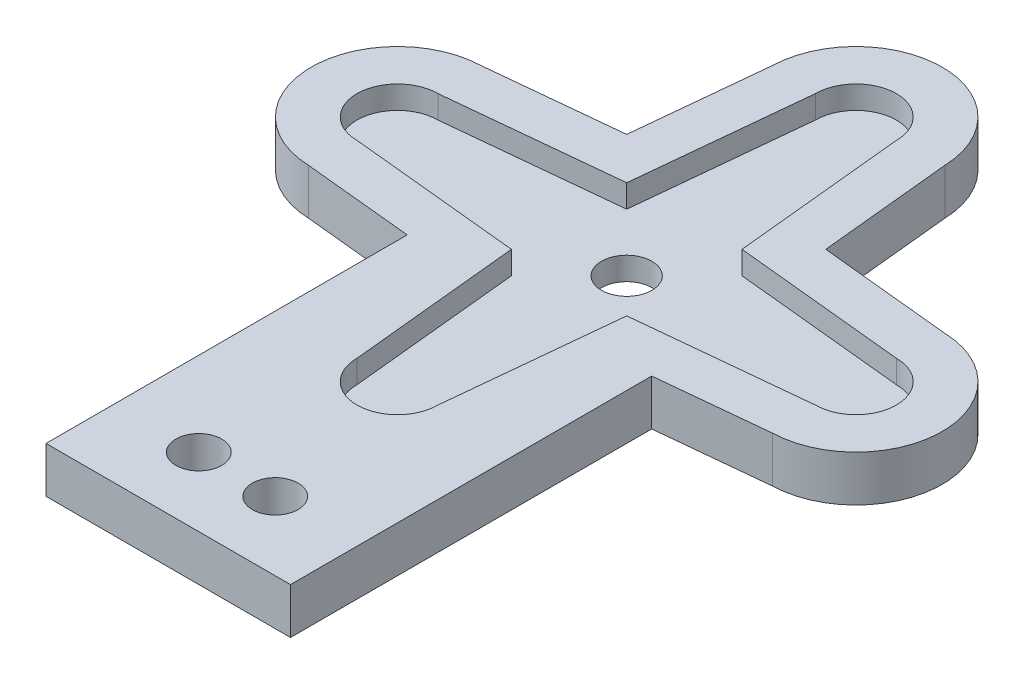
ISO-10303-21;
HEADER;
FILE_DESCRIPTION(('STEP AP214'),'2;1');
FILE_NAME('part.step','',(''),(''),'','','');
FILE_SCHEMA(('AUTOMOTIVE_DESIGN { 1 0 10303 214 1 1 1 1 }'));
ENDSEC;
DATA;
#1=APPLICATION_CONTEXT('core data for automotive mechanical design processes');
#2=APPLICATION_PROTOCOL_DEFINITION('international standard','automotive_design',2000,#1);
#3=PRODUCT_CONTEXT('',#1,'mechanical');
#4=PRODUCT('Part','Part','',(#3));
#5=PRODUCT_RELATED_PRODUCT_CATEGORY('part','',(#4));
#6=PRODUCT_DEFINITION_FORMATION('','',#4);
#7=PRODUCT_DEFINITION_CONTEXT('part definition',#1,'design');
#8=PRODUCT_DEFINITION('design','',#6,#7);
#9=PRODUCT_DEFINITION_SHAPE('','',#8);
#10=(LENGTH_UNIT() NAMED_UNIT(*) SI_UNIT(.MILLI.,.METRE.));
#11=(NAMED_UNIT(*) PLANE_ANGLE_UNIT() SI_UNIT($,.RADIAN.));
#12=(NAMED_UNIT(*) SI_UNIT($,.STERADIAN.) SOLID_ANGLE_UNIT());
#13=UNCERTAINTY_MEASURE_WITH_UNIT(LENGTH_MEASURE(1.E-05),#10,'distance_accuracy_value','');
#14=(GEOMETRIC_REPRESENTATION_CONTEXT(3) GLOBAL_UNCERTAINTY_ASSIGNED_CONTEXT((#13)) GLOBAL_UNIT_ASSIGNED_CONTEXT((#10,
#11,#12)) REPRESENTATION_CONTEXT('',''));
#15=CARTESIAN_POINT('',(0.,0.,0.));
#16=DIRECTION('',(0.,0.,1.));
#17=DIRECTION('',(1.,0.,0.));
#18=AXIS2_PLACEMENT_3D('',#15,#16,#17);
#19=CARTESIAN_POINT('',(0.,1.5,0.));
#20=DIRECTION('',(0.,1.,0.));
#21=DIRECTION('',(0.,0.,1.));
#22=AXIS2_PLACEMENT_3D('',#19,#20,#21);
#23=PLANE('',#22);
#24=DIRECTION('',(0.99503719020999,0.,0.0995037190209885));
#25=VECTOR('',#24,1.);
#26=CARTESIAN_POINT('',(-0.709402246171833,1.5,7.09402246171908));
#27=LINE('',#26,#25);
#28=CARTESIAN_POINT('',(-15.1775224357825,1.5,5.64721044275817));
#29=VERTEX_POINT('',#28);
#30=CARTESIAN_POINT('',(-8.00000000000001,1.5,6.36496268633634));
#31=VERTEX_POINT('',#30);
#32=EDGE_CURVE('E299',#29,#31,#27,.T.);
#33=ORIENTED_EDGE('',*,*,#32,.T.);
#34=DIRECTION('',(0.,0.,1.));
#35=VECTOR('',#34,1.);
#36=CARTESIAN_POINT('',(-7.99999999999999,1.5,0.));
#37=LINE('',#36,#35);
#38=CARTESIAN_POINT('',(-8.,1.5,30.));
#39=VERTEX_POINT('',#38);
#40=EDGE_CURVE('E97',#31,#39,#37,.T.);
#41=ORIENTED_EDGE('',*,*,#40,.T.);
#42=DIRECTION('',(1.,0.,0.));
#43=VECTOR('',#42,1.);
#44=CARTESIAN_POINT('',(-8.,1.5,30.));
#45=LINE('',#44,#43);
#46=CARTESIAN_POINT('',(8.,1.5,30.));
#47=VERTEX_POINT('',#46);
#48=EDGE_CURVE('E63',#39,#47,#45,.T.);
#49=ORIENTED_EDGE('',*,*,#48,.T.);
#50=DIRECTION('',(0.,0.,-1.));
#51=VECTOR('',#50,1.);
#52=CARTESIAN_POINT('',(7.99999999999999,1.5,0.));
#53=LINE('',#52,#51);
#54=CARTESIAN_POINT('',(8.,1.5,6.36496268633621));
#55=VERTEX_POINT('',#54);
#56=EDGE_CURVE('E92',#47,#55,#53,.T.);
#57=ORIENTED_EDGE('',*,*,#56,.T.);
#58=DIRECTION('',(0.995037190209989,0.,-0.0995037190209984));
#59=VECTOR('',#58,1.);
#60=CARTESIAN_POINT('',(0.709402246171898,1.5,7.09402246171902));
#61=LINE('',#60,#59);
#62=CARTESIAN_POINT('',(15.1775224357825,1.5,5.64721044275796));
#63=VERTEX_POINT('',#62);
#64=EDGE_CURVE('E302',#55,#63,#61,.T.);
#65=ORIENTED_EDGE('',*,*,#64,.T.);
#66=CARTESIAN_POINT('',(15.,1.5,0.));
#67=DIRECTION('',(0.,1.,0.));
#68=DIRECTION('',(0.,0.,1.));
#69=AXIS2_PLACEMENT_3D('',#66,#67,#68);
#70=CIRCLE('',#69,5.65000000000012);
#71=CARTESIAN_POINT('',(15.1775224357825,1.5,-5.64721044275807));
#72=VERTEX_POINT('',#71);
#73=EDGE_CURVE('E305',#63,#72,#70,.T.);
#74=ORIENTED_EDGE('',*,*,#73,.T.);
#75=DIRECTION('',(-0.995037190209989,0.,-0.0995037190209997));
#76=VECTOR('',#75,1.);
#77=CARTESIAN_POINT('',(0.709402246171919,1.5,-7.09402246171914));
#78=LINE('',#77,#76);
#79=CARTESIAN_POINT('',(6.51360244212387,1.5,-6.51360244212394));
#80=VERTEX_POINT('',#79);
#81=EDGE_CURVE('E281',#72,#80,#78,.T.);
#82=ORIENTED_EDGE('',*,*,#81,.T.);
#83=DIRECTION('',(-0.0995037190209991,0.,-0.995037190209989));
#84=VECTOR('',#83,1.);
#85=CARTESIAN_POINT('',(7.09402246171908,1.5,-0.709402246171909));
#86=LINE('',#85,#84);
#87=CARTESIAN_POINT('',(5.64721044275801,1.5,-15.1775224357825));
#88=VERTEX_POINT('',#87);
#89=EDGE_CURVE('E284',#80,#88,#86,.T.);
#90=ORIENTED_EDGE('',*,*,#89,.T.);
#91=CARTESIAN_POINT('',(0.,1.5,-15.));
#92=DIRECTION('',(0.,1.,0.));
#93=DIRECTION('',(0.,0.,1.));
#94=AXIS2_PLACEMENT_3D('',#91,#92,#93);
#95=CIRCLE('',#94,5.65000000000012);
#96=CARTESIAN_POINT('',(-5.64721044275801,1.5,-15.1775224357825));
#97=VERTEX_POINT('',#96);
#98=EDGE_CURVE('E287',#88,#97,#95,.T.);
#99=ORIENTED_EDGE('',*,*,#98,.T.);
#100=DIRECTION('',(-0.0995037190209989,0.,0.995037190209989));
#101=VECTOR('',#100,1.);
#102=CARTESIAN_POINT('',(-7.09402246171908,1.5,-0.709402246171907));
#103=LINE('',#102,#101);
#104=CARTESIAN_POINT('',(-6.51360244212388,1.5,-6.51360244212382));
#105=VERTEX_POINT('',#104);
#106=EDGE_CURVE('E290',#97,#105,#103,.T.);
#107=ORIENTED_EDGE('',*,*,#106,.T.);
#108=DIRECTION('',(-0.995037190209988,0.,0.0995037190210094));
#109=VECTOR('',#108,1.);
#110=CARTESIAN_POINT('',(-0.709402246171983,1.5,-7.09402246171907));
#111=LINE('',#110,#109);
#112=CARTESIAN_POINT('',(-15.1775224357826,1.5,-5.64721044275786));
#113=VERTEX_POINT('',#112);
#114=EDGE_CURVE('E293',#105,#113,#111,.T.);
#115=ORIENTED_EDGE('',*,*,#114,.T.);
#116=CARTESIAN_POINT('',(-15.,1.5,1.57116660247941E-13));
#117=DIRECTION('',(0.,1.,0.));
#118=DIRECTION('',(0.,0.,1.));
#119=AXIS2_PLACEMENT_3D('',#116,#117,#118);
#120=CIRCLE('',#119,5.65000000000012);
#121=EDGE_CURVE('E296',#113,#29,#120,.T.);
#122=ORIENTED_EDGE('',*,*,#121,.T.);
#123=EDGE_LOOP('',(#33,#41,#49,#57,#65,#74,#82,#90,#99,#107,#115,#122));
#124=FACE_BOUND('',#123,.T.);
#125=CARTESIAN_POINT('',(2.5,1.5,25.5));
#126=DIRECTION('',(0.,1.,0.));
#127=DIRECTION('',(0.,0.,1.));
#128=AXIS2_PLACEMENT_3D('',#125,#126,#127);
#129=CIRCLE('',#128,1.5);
#130=CARTESIAN_POINT('',(2.5,1.5,27.));
#131=VERTEX_POINT('',#130);
#132=EDGE_CURVE('E219',#131,#131,#129,.T.);
#133=ORIENTED_EDGE('',*,*,#132,.F.);
#134=EDGE_LOOP('',(#133));
#135=FACE_BOUND('',#134,.T.);
#136=CARTESIAN_POINT('',(-2.49999999999999,1.5,25.5));
#137=DIRECTION('',(0.,1.,0.));
#138=DIRECTION('',(0.,0.,1.));
#139=AXIS2_PLACEMENT_3D('',#136,#137,#138);
#140=CIRCLE('',#139,1.5);
#141=CARTESIAN_POINT('',(-2.49999999999999,1.5,27.));
#142=VERTEX_POINT('',#141);
#143=EDGE_CURVE('E216',#142,#142,#140,.T.);
#144=ORIENTED_EDGE('',*,*,#143,.F.);
#145=EDGE_LOOP('',(#144));
#146=FACE_BOUND('',#145,.T.);
#147=DIRECTION('',(-0.995037190209988,0.,0.0995037190210094));
#148=VECTOR('',#147,1.);
#149=CARTESIAN_POINT('',(-0.410891089108954,1.5,-4.1089108910891));
#150=LINE('',#149,#148);
#151=CARTESIAN_POINT('',(-3.77272727272728,1.5,-3.77272727272724));
#152=VERTEX_POINT('',#151);
#153=CARTESIAN_POINT('',(-15.,1.5,-2.64999999999984));
#154=VERTEX_POINT('',#153);
#155=EDGE_CURVE('E163',#152,#154,#150,.T.);
#156=ORIENTED_EDGE('',*,*,#155,.F.);
#157=DIRECTION('',(0.0995037190209989,0.,-0.995037190209989));
#158=VECTOR('',#157,1.);
#159=CARTESIAN_POINT('',(-4.10891089108911,1.5,-0.410891089108911));
#160=LINE('',#159,#158);
#161=CARTESIAN_POINT('',(-2.65,1.5,-15.));
#162=VERTEX_POINT('',#161);
#163=EDGE_CURVE('E115',#152,#162,#160,.T.);
#164=ORIENTED_EDGE('',*,*,#163,.T.);
#165=CARTESIAN_POINT('',(0.,1.5,-15.));
#166=DIRECTION('',(0.,-1.,0.));
#167=DIRECTION('',(0.,0.,-1.));
#168=AXIS2_PLACEMENT_3D('',#165,#166,#167);
#169=CIRCLE('',#168,2.65);
#170=CARTESIAN_POINT('',(2.65,1.5,-15.));
#171=VERTEX_POINT('',#170);
#172=EDGE_CURVE('E118',#162,#171,#169,.T.);
#173=ORIENTED_EDGE('',*,*,#172,.T.);
#174=DIRECTION('',(0.0995037190209989,0.,0.995037190209989));
#175=VECTOR('',#174,1.);
#176=CARTESIAN_POINT('',(4.10891089108911,1.5,-0.410891089108911));
#177=LINE('',#176,#175);
#178=CARTESIAN_POINT('',(3.77272727272727,1.5,-3.77272727272733));
#179=VERTEX_POINT('',#178);
#180=EDGE_CURVE('E111',#171,#179,#177,.T.);
#181=ORIENTED_EDGE('',*,*,#180,.T.);
#182=DIRECTION('',(-0.99503719020999,0.,-0.0995037190209955));
#183=VECTOR('',#182,1.);
#184=CARTESIAN_POINT('',(0.410891089108896,1.5,-4.10891089108911));
#185=LINE('',#184,#183);
#186=CARTESIAN_POINT('',(15.,1.5,-2.65000000000005));
#187=VERTEX_POINT('',#186);
#188=EDGE_CURVE('E139',#187,#179,#185,.T.);
#189=ORIENTED_EDGE('',*,*,#188,.F.);
#190=CARTESIAN_POINT('',(15.,1.5,0.));
#191=DIRECTION('',(0.,1.,0.));
#192=DIRECTION('',(1.,0.,0.));
#193=AXIS2_PLACEMENT_3D('',#190,#191,#192);
#194=CIRCLE('',#193,2.65);
#195=CARTESIAN_POINT('',(15.,1.5,2.64999999999995));
#196=VERTEX_POINT('',#195);
#197=EDGE_CURVE('E142',#196,#187,#194,.T.);
#198=ORIENTED_EDGE('',*,*,#197,.F.);
#199=DIRECTION('',(0.995037190209989,0.,-0.0995037190210024));
#200=VECTOR('',#199,1.);
#201=CARTESIAN_POINT('',(0.410891089108925,1.5,4.10891089108911));
#202=LINE('',#201,#200);
#203=CARTESIAN_POINT('',(3.77272727272728,1.5,3.77272727272721));
#204=VERTEX_POINT('',#203);
#205=EDGE_CURVE('E135',#204,#196,#202,.T.);
#206=ORIENTED_EDGE('',*,*,#205,.F.);
#207=DIRECTION('',(0.0995037190209989,0.,-0.995037190209989));
#208=VECTOR('',#207,1.);
#209=CARTESIAN_POINT('',(4.10891089108911,1.5,0.410891089108911));
#210=LINE('',#209,#208);
#211=CARTESIAN_POINT('',(2.65,1.5,15.));
#212=VERTEX_POINT('',#211);
#213=EDGE_CURVE('E193',#212,#204,#210,.T.);
#214=ORIENTED_EDGE('',*,*,#213,.F.);
#215=CARTESIAN_POINT('',(0.,1.5,15.));
#216=DIRECTION('',(0.,1.,0.));
#217=DIRECTION('',(0.,0.,1.));
#218=AXIS2_PLACEMENT_3D('',#215,#216,#217);
#219=CIRCLE('',#218,2.65);
#220=CARTESIAN_POINT('',(-2.65,1.5,15.));
#221=VERTEX_POINT('',#220);
#222=EDGE_CURVE('E196',#221,#212,#219,.T.);
#223=ORIENTED_EDGE('',*,*,#222,.F.);
#224=DIRECTION('',(0.0995037190209989,0.,0.995037190209989));
#225=VECTOR('',#224,1.);
#226=CARTESIAN_POINT('',(-4.10891089108911,1.5,0.410891089108911));
#227=LINE('',#226,#225);
#228=CARTESIAN_POINT('',(-3.77272727272727,1.5,3.77272727272731));
#229=VERTEX_POINT('',#228);
#230=EDGE_CURVE('E189',#229,#221,#227,.T.);
#231=ORIENTED_EDGE('',*,*,#230,.F.);
#232=DIRECTION('',(0.99503719020999,0.,0.0995037190209885));
#233=VECTOR('',#232,1.);
#234=CARTESIAN_POINT('',(-0.410891089108868,1.5,4.10891089108911));
#235=LINE('',#234,#233);
#236=CARTESIAN_POINT('',(-15.,1.5,2.65000000000016));
#237=VERTEX_POINT('',#236);
#238=EDGE_CURVE('E167',#237,#229,#235,.T.);
#239=ORIENTED_EDGE('',*,*,#238,.F.);
#240=CARTESIAN_POINT('',(-15.,1.5,1.57116660247941E-13));
#241=DIRECTION('',(0.,1.,0.));
#242=DIRECTION('',(-1.,0.,0.));
#243=AXIS2_PLACEMENT_3D('',#240,#241,#242);
#244=CIRCLE('',#243,2.65);
#245=EDGE_CURVE('E170',#154,#237,#244,.T.);
#246=ORIENTED_EDGE('',*,*,#245,.F.);
#247=EDGE_LOOP('',(#156,#164,#173,#181,#189,#198,#206,#214,#223,#231,#239,#246));
#248=FACE_BOUND('',#247,.T.);
#249=ADVANCED_FACE('F39',(#124,#135,#146,#248),#23,.T.);
#250=CARTESIAN_POINT('',(0.,0.,0.));
#251=DIRECTION('',(0.,1.,0.));
#252=DIRECTION('',(0.,0.,1.));
#253=AXIS2_PLACEMENT_3D('',#250,#251,#252);
#254=PLANE('',#253);
#255=CARTESIAN_POINT('',(0.,0.,0.));
#256=DIRECTION('',(0.,1.,0.));
#257=DIRECTION('',(0.,0.,1.));
#258=AXIS2_PLACEMENT_3D('',#255,#256,#257);
#259=CIRCLE('',#258,1.65);
#260=CARTESIAN_POINT('',(0.,0.,1.65));
#261=VERTEX_POINT('',#260);
#262=EDGE_CURVE('E212',#261,#261,#259,.T.);
#263=ORIENTED_EDGE('',*,*,#262,.F.);
#264=EDGE_LOOP('',(#263));
#265=FACE_BOUND('',#264,.T.);
#266=DIRECTION('',(-0.99503719020999,0.,-0.0995037190209955));
#267=VECTOR('',#266,1.);
#268=CARTESIAN_POINT('',(0.410891089108896,0.,-4.10891089108911));
#269=LINE('',#268,#267);
#270=CARTESIAN_POINT('',(15.,0.,-2.65000000000005));
#271=VERTEX_POINT('',#270);
#272=CARTESIAN_POINT('',(3.77272727272727,0.,-3.77272727272733));
#273=VERTEX_POINT('',#272);
#274=EDGE_CURVE('E148',#271,#273,#269,.T.);
#275=ORIENTED_EDGE('',*,*,#274,.T.);
#276=DIRECTION('',(0.0995037190209989,0.,0.995037190209989));
#277=VECTOR('',#276,1.);
#278=CARTESIAN_POINT('',(4.10891089108911,0.,-0.410891089108911));
#279=LINE('',#278,#277);
#280=CARTESIAN_POINT('',(2.65,0.,-15.));
#281=VERTEX_POINT('',#280);
#282=EDGE_CURVE('E108',#281,#273,#279,.T.);
#283=ORIENTED_EDGE('',*,*,#282,.F.);
#284=CARTESIAN_POINT('',(0.,0.,-15.));
#285=DIRECTION('',(0.,-1.,0.));
#286=DIRECTION('',(0.,0.,-1.));
#287=AXIS2_PLACEMENT_3D('',#284,#285,#286);
#288=CIRCLE('',#287,2.65);
#289=CARTESIAN_POINT('',(-2.65,0.,-15.));
#290=VERTEX_POINT('',#289);
#291=EDGE_CURVE('E114',#290,#281,#288,.T.);
#292=ORIENTED_EDGE('',*,*,#291,.F.);
#293=DIRECTION('',(0.0995037190209989,0.,-0.995037190209989));
#294=VECTOR('',#293,1.);
#295=CARTESIAN_POINT('',(-4.10891089108911,0.,-0.410891089108911));
#296=LINE('',#295,#294);
#297=CARTESIAN_POINT('',(-3.77272727272728,0.,-3.77272727272724));
#298=VERTEX_POINT('',#297);
#299=EDGE_CURVE('E124',#298,#290,#296,.T.);
#300=ORIENTED_EDGE('',*,*,#299,.F.);
#301=DIRECTION('',(-0.995037190209988,0.,0.0995037190210094));
#302=VECTOR('',#301,1.);
#303=CARTESIAN_POINT('',(-0.410891089108954,0.,-4.1089108910891));
#304=LINE('',#303,#302);
#305=CARTESIAN_POINT('',(-15.,0.,-2.64999999999984));
#306=VERTEX_POINT('',#305);
#307=EDGE_CURVE('E54',#298,#306,#304,.T.);
#308=ORIENTED_EDGE('',*,*,#307,.T.);
#309=CARTESIAN_POINT('',(-15.,0.,1.57116660247941E-13));
#310=DIRECTION('',(0.,1.,0.));
#311=DIRECTION('',(-1.,0.,0.));
#312=AXIS2_PLACEMENT_3D('',#309,#310,#311);
#313=CIRCLE('',#312,2.65);
#314=CARTESIAN_POINT('',(-15.,0.,2.65000000000016));
#315=VERTEX_POINT('',#314);
#316=EDGE_CURVE('E166',#306,#315,#313,.T.);
#317=ORIENTED_EDGE('',*,*,#316,.T.);
#318=DIRECTION('',(0.99503719020999,0.,0.0995037190209885));
#319=VECTOR('',#318,1.);
#320=CARTESIAN_POINT('',(-0.410891089108868,0.,4.10891089108911));
#321=LINE('',#320,#319);
#322=CARTESIAN_POINT('',(-3.77272727272727,0.,3.77272727272731));
#323=VERTEX_POINT('',#322);
#324=EDGE_CURVE('E175',#315,#323,#321,.T.);
#325=ORIENTED_EDGE('',*,*,#324,.T.);
#326=DIRECTION('',(0.0995037190209989,0.,0.995037190209989));
#327=VECTOR('',#326,1.);
#328=CARTESIAN_POINT('',(-4.10891089108911,0.,0.410891089108911));
#329=LINE('',#328,#327);
#330=CARTESIAN_POINT('',(-2.65,0.,15.));
#331=VERTEX_POINT('',#330);
#332=EDGE_CURVE('E186',#323,#331,#329,.T.);
#333=ORIENTED_EDGE('',*,*,#332,.T.);
#334=CARTESIAN_POINT('',(0.,0.,15.));
#335=DIRECTION('',(0.,1.,0.));
#336=DIRECTION('',(0.,0.,1.));
#337=AXIS2_PLACEMENT_3D('',#334,#335,#336);
#338=CIRCLE('',#337,2.65);
#339=CARTESIAN_POINT('',(2.65,0.,15.));
#340=VERTEX_POINT('',#339);
#341=EDGE_CURVE('E192',#331,#340,#338,.T.);
#342=ORIENTED_EDGE('',*,*,#341,.T.);
#343=DIRECTION('',(0.0995037190209989,0.,-0.995037190209989));
#344=VECTOR('',#343,1.);
#345=CARTESIAN_POINT('',(4.10891089108911,0.,0.410891089108911));
#346=LINE('',#345,#344);
#347=CARTESIAN_POINT('',(3.77272727272728,0.,3.77272727272721));
#348=VERTEX_POINT('',#347);
#349=EDGE_CURVE('E202',#340,#348,#346,.T.);
#350=ORIENTED_EDGE('',*,*,#349,.T.);
#351=DIRECTION('',(0.995037190209989,0.,-0.0995037190210024));
#352=VECTOR('',#351,1.);
#353=CARTESIAN_POINT('',(0.410891089108925,0.,4.10891089108911));
#354=LINE('',#353,#352);
#355=CARTESIAN_POINT('',(15.,0.,2.64999999999995));
#356=VERTEX_POINT('',#355);
#357=EDGE_CURVE('E132',#348,#356,#354,.T.);
#358=ORIENTED_EDGE('',*,*,#357,.T.);
#359=CARTESIAN_POINT('',(15.,0.,0.));
#360=DIRECTION('',(0.,1.,0.));
#361=DIRECTION('',(1.,0.,0.));
#362=AXIS2_PLACEMENT_3D('',#359,#360,#361);
#363=CIRCLE('',#362,2.65);
#364=EDGE_CURVE('E138',#356,#271,#363,.T.);
#365=ORIENTED_EDGE('',*,*,#364,.T.);
#366=EDGE_LOOP('',(#275,#283,#292,#300,#308,#317,#325,#333,#342,#350,#358,#365));
#367=FACE_BOUND('',#366,.T.);
#368=ADVANCED_FACE('F425',(#265,#367),#254,.T.);
#369=CARTESIAN_POINT('',(0.,-1.5,0.));
#370=DIRECTION('',(0.,1.,0.));
#371=DIRECTION('',(0.,0.,1.));
#372=AXIS2_PLACEMENT_3D('',#369,#370,#371);
#373=PLANE('',#372);
#374=CARTESIAN_POINT('',(2.5,-1.5,25.5));
#375=DIRECTION('',(0.,1.,0.));
#376=DIRECTION('',(0.,0.,1.));
#377=AXIS2_PLACEMENT_3D('',#374,#375,#376);
#378=CIRCLE('',#377,1.5);
#379=CARTESIAN_POINT('',(2.5,-1.5,27.));
#380=VERTEX_POINT('',#379);
#381=EDGE_CURVE('E215',#380,#380,#378,.F.);
#382=ORIENTED_EDGE('',*,*,#381,.F.);
#383=EDGE_LOOP('',(#382));
#384=FACE_BOUND('',#383,.T.);
#385=CARTESIAN_POINT('',(-2.49999999999999,-1.5,25.5));
#386=DIRECTION('',(0.,1.,0.));
#387=DIRECTION('',(0.,0.,1.));
#388=AXIS2_PLACEMENT_3D('',#385,#386,#387);
#389=CIRCLE('',#388,1.5);
#390=CARTESIAN_POINT('',(-2.49999999999999,-1.5,27.));
#391=VERTEX_POINT('',#390);
#392=EDGE_CURVE('E220',#391,#391,#389,.F.);
#393=ORIENTED_EDGE('',*,*,#392,.F.);
#394=EDGE_LOOP('',(#393));
#395=FACE_BOUND('',#394,.T.);
#396=CARTESIAN_POINT('',(0.,-1.5,0.));
#397=DIRECTION('',(0.,1.,0.));
#398=DIRECTION('',(0.,0.,1.));
#399=AXIS2_PLACEMENT_3D('',#396,#397,#398);
#400=CIRCLE('',#399,1.65);
#401=CARTESIAN_POINT('',(0.,-1.5,1.65));
#402=VERTEX_POINT('',#401);
#403=EDGE_CURVE('E209',#402,#402,#400,.F.);
#404=ORIENTED_EDGE('',*,*,#403,.F.);
#405=EDGE_LOOP('',(#404));
#406=FACE_BOUND('',#405,.T.);
#407=DIRECTION('',(0.,0.,1.));
#408=VECTOR('',#407,1.);
#409=CARTESIAN_POINT('',(-7.99999999999999,-1.5,0.));
#410=LINE('',#409,#408);
#411=CARTESIAN_POINT('',(-8.00000000000001,-1.5,6.36496268633634));
#412=VERTEX_POINT('',#411);
#413=CARTESIAN_POINT('',(-8.,-1.5,30.));
#414=VERTEX_POINT('',#413);
#415=EDGE_CURVE('E84',#412,#414,#410,.T.);
#416=ORIENTED_EDGE('',*,*,#415,.F.);
#417=DIRECTION('',(0.99503719020999,0.,0.0995037190209885));
#418=VECTOR('',#417,1.);
#419=CARTESIAN_POINT('',(-0.709402246171833,-1.5,7.09402246171908));
#420=LINE('',#419,#418);
#421=CARTESIAN_POINT('',(-15.1775224357825,-1.5,5.64721044275817));
#422=VERTEX_POINT('',#421);
#423=EDGE_CURVE('E274',#422,#412,#420,.T.);
#424=ORIENTED_EDGE('',*,*,#423,.F.);
#425=CARTESIAN_POINT('',(-15.,-1.5,1.57116660247941E-13));
#426=DIRECTION('',(0.,1.,0.));
#427=DIRECTION('',(0.,0.,1.));
#428=AXIS2_PLACEMENT_3D('',#425,#426,#427);
#429=CIRCLE('',#428,5.65000000000012);
#430=CARTESIAN_POINT('',(-15.1775224357826,-1.5,-5.64721044275786));
#431=VERTEX_POINT('',#430);
#432=EDGE_CURVE('E271',#431,#422,#429,.T.);
#433=ORIENTED_EDGE('',*,*,#432,.F.);
#434=DIRECTION('',(-0.995037190209988,0.,0.0995037190210094));
#435=VECTOR('',#434,1.);
#436=CARTESIAN_POINT('',(-0.709402246171983,-1.5,-7.09402246171907));
#437=LINE('',#436,#435);
#438=CARTESIAN_POINT('',(-6.51360244212388,-1.5,-6.51360244212382));
#439=VERTEX_POINT('',#438);
#440=EDGE_CURVE('E268',#439,#431,#437,.T.);
#441=ORIENTED_EDGE('',*,*,#440,.F.);
#442=DIRECTION('',(-0.0995037190209989,0.,0.995037190209989));
#443=VECTOR('',#442,1.);
#444=CARTESIAN_POINT('',(-7.09402246171908,-1.5,-0.709402246171907));
#445=LINE('',#444,#443);
#446=CARTESIAN_POINT('',(-5.64721044275801,-1.5,-15.1775224357825));
#447=VERTEX_POINT('',#446);
#448=EDGE_CURVE('E265',#447,#439,#445,.T.);
#449=ORIENTED_EDGE('',*,*,#448,.F.);
#450=CARTESIAN_POINT('',(0.,-1.5,-15.));
#451=DIRECTION('',(0.,1.,0.));
#452=DIRECTION('',(0.,0.,1.));
#453=AXIS2_PLACEMENT_3D('',#450,#451,#452);
#454=CIRCLE('',#453,5.65000000000012);
#455=CARTESIAN_POINT('',(5.64721044275801,-1.5,-15.1775224357825));
#456=VERTEX_POINT('',#455);
#457=EDGE_CURVE('E262',#456,#447,#454,.T.);
#458=ORIENTED_EDGE('',*,*,#457,.F.);
#459=DIRECTION('',(-0.0995037190209991,0.,-0.995037190209989));
#460=VECTOR('',#459,1.);
#461=CARTESIAN_POINT('',(7.09402246171908,-1.5,-0.709402246171909));
#462=LINE('',#461,#460);
#463=CARTESIAN_POINT('',(6.51360244212387,-1.5,-6.51360244212394));
#464=VERTEX_POINT('',#463);
#465=EDGE_CURVE('E259',#464,#456,#462,.T.);
#466=ORIENTED_EDGE('',*,*,#465,.F.);
#467=DIRECTION('',(-0.995037190209989,0.,-0.0995037190209997));
#468=VECTOR('',#467,1.);
#469=CARTESIAN_POINT('',(0.709402246171919,-1.5,-7.09402246171914));
#470=LINE('',#469,#468);
#471=CARTESIAN_POINT('',(15.1775224357825,-1.5,-5.64721044275807));
#472=VERTEX_POINT('',#471);
#473=EDGE_CURVE('E232',#472,#464,#470,.T.);
#474=ORIENTED_EDGE('',*,*,#473,.F.);
#475=CARTESIAN_POINT('',(15.,-1.5,0.));
#476=DIRECTION('',(0.,1.,0.));
#477=DIRECTION('',(0.,0.,1.));
#478=AXIS2_PLACEMENT_3D('',#475,#476,#477);
#479=CIRCLE('',#478,5.65000000000012);
#480=CARTESIAN_POINT('',(15.1775224357825,-1.5,5.64721044275796));
#481=VERTEX_POINT('',#480);
#482=EDGE_CURVE('E278',#481,#472,#479,.T.);
#483=ORIENTED_EDGE('',*,*,#482,.F.);
#484=DIRECTION('',(0.995037190209989,0.,-0.0995037190209984));
#485=VECTOR('',#484,1.);
#486=CARTESIAN_POINT('',(0.709402246171898,-1.5,7.09402246171902));
#487=LINE('',#486,#485);
#488=CARTESIAN_POINT('',(8.,-1.5,6.36496268633621));
#489=VERTEX_POINT('',#488);
#490=EDGE_CURVE('E96',#489,#481,#487,.T.);
#491=ORIENTED_EDGE('',*,*,#490,.F.);
#492=DIRECTION('',(0.,0.,-1.));
#493=VECTOR('',#492,1.);
#494=CARTESIAN_POINT('',(7.99999999999999,-1.5,0.));
#495=LINE('',#494,#493);
#496=CARTESIAN_POINT('',(8.,-1.5,30.));
#497=VERTEX_POINT('',#496);
#498=EDGE_CURVE('E83',#497,#489,#495,.T.);
#499=ORIENTED_EDGE('',*,*,#498,.F.);
#500=DIRECTION('',(1.,0.,0.));
#501=VECTOR('',#500,1.);
#502=CARTESIAN_POINT('',(-8.,-1.5,30.));
#503=LINE('',#502,#501);
#504=EDGE_CURVE('E75',#414,#497,#503,.T.);
#505=ORIENTED_EDGE('',*,*,#504,.F.);
#506=EDGE_LOOP('',(#416,#424,#433,#441,#449,#458,#466,#474,#483,#491,#499,#505));
#507=FACE_BOUND('',#506,.T.);
#508=ADVANCED_FACE('F41',(#384,#395,#406,#507),#373,.F.);
#509=CARTESIAN_POINT('',(-7.99999999999999,1.5,0.));
#510=DIRECTION('',(1.,0.,0.));
#511=DIRECTION('',(0.,0.,-1.));
#512=AXIS2_PLACEMENT_3D('',#509,#510,#511);
#513=PLANE('',#512);
#514=ORIENTED_EDGE('',*,*,#40,.F.);
#515=DIRECTION('',(0.,1.,0.));
#516=VECTOR('',#515,1.);
#517=CARTESIAN_POINT('',(-8.00000000000001,-1.5,6.36496268633634));
#518=LINE('',#517,#516);
#519=EDGE_CURVE('E234',#412,#31,#518,.T.);
#520=ORIENTED_EDGE('',*,*,#519,.F.);
#521=ORIENTED_EDGE('',*,*,#415,.T.);
#522=DIRECTION('',(0.,-1.,0.));
#523=VECTOR('',#522,1.);
#524=CARTESIAN_POINT('',(-8.,1.5,30.));
#525=LINE('',#524,#523);
#526=EDGE_CURVE('E11',#39,#414,#525,.T.);
#527=ORIENTED_EDGE('',*,*,#526,.F.);
#528=EDGE_LOOP('',(#514,#520,#521,#527));
#529=FACE_BOUND('',#528,.T.);
#530=ADVANCED_FACE('F475',(#529),#513,.F.);
#531=CARTESIAN_POINT('',(7.99999999999999,1.5,0.));
#532=DIRECTION('',(-1.,0.,0.));
#533=DIRECTION('',(0.,0.,1.));
#534=AXIS2_PLACEMENT_3D('',#531,#532,#533);
#535=PLANE('',#534);
#536=ORIENTED_EDGE('',*,*,#498,.T.);
#537=DIRECTION('',(0.,1.,0.));
#538=VECTOR('',#537,1.);
#539=CARTESIAN_POINT('',(8.,-1.5,6.36496268633621));
#540=LINE('',#539,#538);
#541=EDGE_CURVE('E231',#489,#55,#540,.T.);
#542=ORIENTED_EDGE('',*,*,#541,.T.);
#543=ORIENTED_EDGE('',*,*,#56,.F.);
#544=DIRECTION('',(0.,-1.,0.));
#545=VECTOR('',#544,1.);
#546=CARTESIAN_POINT('',(8.,1.5,30.));
#547=LINE('',#546,#545);
#548=EDGE_CURVE('E47',#47,#497,#547,.T.);
#549=ORIENTED_EDGE('',*,*,#548,.T.);
#550=EDGE_LOOP('',(#536,#542,#543,#549));
#551=FACE_BOUND('',#550,.T.);
#552=ADVANCED_FACE('F88',(#551),#535,.F.);
#553=CARTESIAN_POINT('',(-8.,1.5,30.));
#554=DIRECTION('',(0.,0.,-1.));
#555=DIRECTION('',(-1.,0.,0.));
#556=AXIS2_PLACEMENT_3D('',#553,#554,#555);
#557=PLANE('',#556);
#558=ORIENTED_EDGE('',*,*,#504,.T.);
#559=ORIENTED_EDGE('',*,*,#548,.F.);
#560=ORIENTED_EDGE('',*,*,#48,.F.);
#561=ORIENTED_EDGE('',*,*,#526,.T.);
#562=EDGE_LOOP('',(#558,#559,#560,#561));
#563=FACE_BOUND('',#562,.T.);
#564=ADVANCED_FACE('F77',(#563),#557,.F.);
#565=CARTESIAN_POINT('',(4.10891089108911,0.,-0.410891089108911));
#566=DIRECTION('',(-0.995037190209989,0.,0.0995037190209989));
#567=DIRECTION('',(0.0995037190209989,0.,0.995037190209989));
#568=AXIS2_PLACEMENT_3D('',#565,#566,#567);
#569=PLANE('',#568);
#570=DIRECTION('',(0.,1.,0.));
#571=VECTOR('',#570,1.);
#572=CARTESIAN_POINT('',(3.77272727272727,0.,-3.77272727272733));
#573=LINE('',#572,#571);
#574=EDGE_CURVE('E173',#273,#179,#573,.T.);
#575=ORIENTED_EDGE('',*,*,#574,.T.);
#576=ORIENTED_EDGE('',*,*,#180,.F.);
#577=DIRECTION('',(0.,1.,0.));
#578=VECTOR('',#577,1.);
#579=CARTESIAN_POINT('',(2.65,0.,-15.));
#580=LINE('',#579,#578);
#581=EDGE_CURVE('E102',#281,#171,#580,.T.);
#582=ORIENTED_EDGE('',*,*,#581,.F.);
#583=ORIENTED_EDGE('',*,*,#282,.T.);
#584=EDGE_LOOP('',(#575,#576,#582,#583));
#585=FACE_BOUND('',#584,.T.);
#586=ADVANCED_FACE('F410',(#585),#569,.T.);
#587=CARTESIAN_POINT('',(-4.10891089108911,0.,-0.410891089108911));
#588=DIRECTION('',(0.995037190209989,0.,0.0995037190209989));
#589=DIRECTION('',(0.0995037190209989,0.,-0.995037190209989));
#590=AXIS2_PLACEMENT_3D('',#587,#588,#589);
#591=PLANE('',#590);
#592=DIRECTION('',(0.,-1.,0.));
#593=VECTOR('',#592,1.);
#594=CARTESIAN_POINT('',(-3.77272727272728,0.,-3.77272727272724));
#595=LINE('',#594,#593);
#596=EDGE_CURVE('E155',#152,#298,#595,.T.);
#597=ORIENTED_EDGE('',*,*,#596,.T.);
#598=ORIENTED_EDGE('',*,*,#299,.T.);
#599=DIRECTION('',(0.,1.,0.));
#600=VECTOR('',#599,1.);
#601=CARTESIAN_POINT('',(-2.65,0.,-15.));
#602=LINE('',#601,#600);
#603=EDGE_CURVE('E105',#290,#162,#602,.T.);
#604=ORIENTED_EDGE('',*,*,#603,.T.);
#605=ORIENTED_EDGE('',*,*,#163,.F.);
#606=EDGE_LOOP('',(#597,#598,#604,#605));
#607=FACE_BOUND('',#606,.T.);
#608=ADVANCED_FACE('F422',(#607),#591,.T.);
#609=CARTESIAN_POINT('',(0.,0.,-15.));
#610=DIRECTION('',(0.,1.,0.));
#611=DIRECTION('',(0.,0.,1.));
#612=AXIS2_PLACEMENT_3D('',#609,#610,#611);
#613=CYLINDRICAL_SURFACE('',#612,2.65);
#614=ORIENTED_EDGE('',*,*,#172,.F.);
#615=ORIENTED_EDGE('',*,*,#603,.F.);
#616=ORIENTED_EDGE('',*,*,#291,.T.);
#617=ORIENTED_EDGE('',*,*,#581,.T.);
#618=EDGE_LOOP('',(#614,#615,#616,#617));
#619=FACE_BOUND('',#618,.T.);
#620=ADVANCED_FACE('F415',(#619),#613,.F.);
#621=CARTESIAN_POINT('',(15.,0.,0.));
#622=DIRECTION('',(0.,1.,0.));
#623=DIRECTION('',(0.,0.,1.));
#624=AXIS2_PLACEMENT_3D('',#621,#622,#623);
#625=CYLINDRICAL_SURFACE('',#624,2.65);
#626=ORIENTED_EDGE('',*,*,#197,.T.);
#627=DIRECTION('',(0.,1.,0.));
#628=VECTOR('',#627,1.);
#629=CARTESIAN_POINT('',(15.,0.,-2.65000000000005));
#630=LINE('',#629,#628);
#631=EDGE_CURVE('E129',#271,#187,#630,.T.);
#632=ORIENTED_EDGE('',*,*,#631,.F.);
#633=ORIENTED_EDGE('',*,*,#364,.F.);
#634=DIRECTION('',(0.,1.,0.));
#635=VECTOR('',#634,1.);
#636=CARTESIAN_POINT('',(15.,0.,2.64999999999995));
#637=LINE('',#636,#635);
#638=EDGE_CURVE('E121',#356,#196,#637,.T.);
#639=ORIENTED_EDGE('',*,*,#638,.T.);
#640=EDGE_LOOP('',(#626,#632,#633,#639));
#641=FACE_BOUND('',#640,.T.);
#642=ADVANCED_FACE('F434',(#641),#625,.F.);
#643=CARTESIAN_POINT('',(0.410891089108925,0.,4.10891089108911));
#644=DIRECTION('',(0.0995037190210024,0.,0.995037190209989));
#645=DIRECTION('',(0.995037190209989,0.,-0.0995037190210024));
#646=AXIS2_PLACEMENT_3D('',#643,#644,#645);
#647=PLANE('',#646);
#648=DIRECTION('',(0.,-1.,0.));
#649=VECTOR('',#648,1.);
#650=CARTESIAN_POINT('',(3.77272727272728,0.,3.77272727272721));
#651=LINE('',#650,#649);
#652=EDGE_CURVE('E199',#204,#348,#651,.T.);
#653=ORIENTED_EDGE('',*,*,#652,.F.);
#654=ORIENTED_EDGE('',*,*,#205,.T.);
#655=ORIENTED_EDGE('',*,*,#638,.F.);
#656=ORIENTED_EDGE('',*,*,#357,.F.);
#657=EDGE_LOOP('',(#653,#654,#655,#656));
#658=FACE_BOUND('',#657,.T.);
#659=ADVANCED_FACE('F438',(#658),#647,.F.);
#660=CARTESIAN_POINT('',(0.410891089108896,0.,-4.10891089108911));
#661=DIRECTION('',(0.0995037190209954,0.,-0.995037190209989));
#662=DIRECTION('',(-0.995037190209989,0.,-0.0995037190209954));
#663=AXIS2_PLACEMENT_3D('',#660,#661,#662);
#664=PLANE('',#663);
#665=ORIENTED_EDGE('',*,*,#574,.F.);
#666=ORIENTED_EDGE('',*,*,#274,.F.);
#667=ORIENTED_EDGE('',*,*,#631,.T.);
#668=ORIENTED_EDGE('',*,*,#188,.T.);
#669=EDGE_LOOP('',(#665,#666,#667,#668));
#670=FACE_BOUND('',#669,.T.);
#671=ADVANCED_FACE('F429',(#670),#664,.F.);
#672=CARTESIAN_POINT('',(-0.410891089108868,0.,4.10891089108911));
#673=DIRECTION('',(-0.0995037190209885,0.,0.99503719020999));
#674=DIRECTION('',(0.99503719020999,0.,0.0995037190209885));
#675=AXIS2_PLACEMENT_3D('',#672,#673,#674);
#676=PLANE('',#675);
#677=DIRECTION('',(0.,-1.,0.));
#678=VECTOR('',#677,1.);
#679=CARTESIAN_POINT('',(-3.77272727272727,0.,3.77272727272731));
#680=LINE('',#679,#678);
#681=EDGE_CURVE('E145',#229,#323,#680,.T.);
#682=ORIENTED_EDGE('',*,*,#681,.T.);
#683=ORIENTED_EDGE('',*,*,#324,.F.);
#684=DIRECTION('',(0.,1.,0.));
#685=VECTOR('',#684,1.);
#686=CARTESIAN_POINT('',(-15.,0.,2.65000000000016));
#687=LINE('',#686,#685);
#688=EDGE_CURVE('E158',#315,#237,#687,.T.);
#689=ORIENTED_EDGE('',*,*,#688,.T.);
#690=ORIENTED_EDGE('',*,*,#238,.T.);
#691=EDGE_LOOP('',(#682,#683,#689,#690));
#692=FACE_BOUND('',#691,.T.);
#693=ADVANCED_FACE('F454',(#692),#676,.F.);
#694=CARTESIAN_POINT('',(-0.410891089108954,0.,-4.1089108910891));
#695=DIRECTION('',(-0.0995037190210093,0.,-0.995037190209988));
#696=DIRECTION('',(-0.995037190209988,0.,0.0995037190210094));
#697=AXIS2_PLACEMENT_3D('',#694,#695,#696);
#698=PLANE('',#697);
#699=ORIENTED_EDGE('',*,*,#155,.T.);
#700=DIRECTION('',(0.,1.,0.));
#701=VECTOR('',#700,1.);
#702=CARTESIAN_POINT('',(-15.,0.,-2.64999999999984));
#703=LINE('',#702,#701);
#704=EDGE_CURVE('E157',#306,#154,#703,.T.);
#705=ORIENTED_EDGE('',*,*,#704,.F.);
#706=ORIENTED_EDGE('',*,*,#307,.F.);
#707=ORIENTED_EDGE('',*,*,#596,.F.);
#708=EDGE_LOOP('',(#699,#705,#706,#707));
#709=FACE_BOUND('',#708,.T.);
#710=ADVANCED_FACE('F458',(#709),#698,.F.);
#711=CARTESIAN_POINT('',(-15.,0.,1.57116660247941E-13));
#712=DIRECTION('',(0.,1.,0.));
#713=DIRECTION('',(0.,0.,1.));
#714=AXIS2_PLACEMENT_3D('',#711,#712,#713);
#715=CYLINDRICAL_SURFACE('',#714,2.65);
#716=ORIENTED_EDGE('',*,*,#245,.T.);
#717=ORIENTED_EDGE('',*,*,#688,.F.);
#718=ORIENTED_EDGE('',*,*,#316,.F.);
#719=ORIENTED_EDGE('',*,*,#704,.T.);
#720=EDGE_LOOP('',(#716,#717,#718,#719));
#721=FACE_BOUND('',#720,.T.);
#722=ADVANCED_FACE('F456',(#721),#715,.F.);
#723=CARTESIAN_POINT('',(0.,0.,15.));
#724=DIRECTION('',(0.,1.,0.));
#725=DIRECTION('',(0.,0.,1.));
#726=AXIS2_PLACEMENT_3D('',#723,#724,#725);
#727=CYLINDRICAL_SURFACE('',#726,2.65);
#728=ORIENTED_EDGE('',*,*,#222,.T.);
#729=DIRECTION('',(0.,1.,0.));
#730=VECTOR('',#729,1.);
#731=CARTESIAN_POINT('',(2.65,0.,15.));
#732=LINE('',#731,#730);
#733=EDGE_CURVE('E183',#340,#212,#732,.T.);
#734=ORIENTED_EDGE('',*,*,#733,.F.);
#735=ORIENTED_EDGE('',*,*,#341,.F.);
#736=DIRECTION('',(0.,1.,0.));
#737=VECTOR('',#736,1.);
#738=CARTESIAN_POINT('',(-2.65,0.,15.));
#739=LINE('',#738,#737);
#740=EDGE_CURVE('E182',#331,#221,#739,.T.);
#741=ORIENTED_EDGE('',*,*,#740,.T.);
#742=EDGE_LOOP('',(#728,#734,#735,#741));
#743=FACE_BOUND('',#742,.T.);
#744=ADVANCED_FACE('F446',(#743),#727,.F.);
#745=CARTESIAN_POINT('',(-4.10891089108911,0.,0.410891089108911));
#746=DIRECTION('',(-0.995037190209989,0.,0.0995037190209989));
#747=DIRECTION('',(0.0995037190209989,0.,0.995037190209989));
#748=AXIS2_PLACEMENT_3D('',#745,#746,#747);
#749=PLANE('',#748);
#750=ORIENTED_EDGE('',*,*,#230,.T.);
#751=ORIENTED_EDGE('',*,*,#740,.F.);
#752=ORIENTED_EDGE('',*,*,#332,.F.);
#753=ORIENTED_EDGE('',*,*,#681,.F.);
#754=EDGE_LOOP('',(#750,#751,#752,#753));
#755=FACE_BOUND('',#754,.T.);
#756=ADVANCED_FACE('F451',(#755),#749,.F.);
#757=CARTESIAN_POINT('',(4.10891089108911,0.,0.410891089108911));
#758=DIRECTION('',(0.995037190209989,0.,0.0995037190209989));
#759=DIRECTION('',(0.0995037190209989,0.,-0.995037190209989));
#760=AXIS2_PLACEMENT_3D('',#757,#758,#759);
#761=PLANE('',#760);
#762=ORIENTED_EDGE('',*,*,#652,.T.);
#763=ORIENTED_EDGE('',*,*,#349,.F.);
#764=ORIENTED_EDGE('',*,*,#733,.T.);
#765=ORIENTED_EDGE('',*,*,#213,.T.);
#766=EDGE_LOOP('',(#762,#763,#764,#765));
#767=FACE_BOUND('',#766,.T.);
#768=ADVANCED_FACE('F441',(#767),#761,.F.);
#769=CARTESIAN_POINT('',(0.,-1.501,0.));
#770=DIRECTION('',(0.,1.,0.));
#771=DIRECTION('',(0.,0.,1.));
#772=AXIS2_PLACEMENT_3D('',#769,#770,#771);
#773=CYLINDRICAL_SURFACE('',#772,1.65);
#774=ORIENTED_EDGE('',*,*,#262,.T.);
#775=EDGE_LOOP('',(#774));
#776=FACE_BOUND('',#775,.T.);
#777=ORIENTED_EDGE('',*,*,#403,.T.);
#778=EDGE_LOOP('',(#777));
#779=FACE_BOUND('',#778,.T.);
#780=ADVANCED_FACE('F545',(#776,#779),#773,.F.);
#781=CARTESIAN_POINT('',(-2.49999999999999,-1.501,25.5));
#782=DIRECTION('',(0.,1.,0.));
#783=DIRECTION('',(0.,0.,1.));
#784=AXIS2_PLACEMENT_3D('',#781,#782,#783);
#785=CYLINDRICAL_SURFACE('',#784,1.5);
#786=CARTESIAN_POINT('',(-2.49999999999999,1.5,27.));
#787=CARTESIAN_POINT('',(-2.49999999999999,1.46875,27.));
#788=CARTESIAN_POINT('',(-2.49999999999999,1.4375,27.));
#789=CARTESIAN_POINT('',(-2.49999999999999,1.375,27.));
#790=CARTESIAN_POINT('',(-2.49999999999999,1.34375,27.));
#791=CARTESIAN_POINT('',(-2.49999999999999,1.28125,27.));
#792=CARTESIAN_POINT('',(-2.49999999999999,1.25,27.));
#793=CARTESIAN_POINT('',(-2.49999999999999,1.1875,27.));
#794=CARTESIAN_POINT('',(-2.49999999999999,1.15625,27.));
#795=CARTESIAN_POINT('',(-2.49999999999999,1.09375,27.));
#796=CARTESIAN_POINT('',(-2.49999999999999,1.0625,27.));
#797=CARTESIAN_POINT('',(-2.49999999999999,1.,27.));
#798=CARTESIAN_POINT('',(-2.49999999999999,0.96875,27.));
#799=CARTESIAN_POINT('',(-2.49999999999999,0.90625,27.));
#800=CARTESIAN_POINT('',(-2.49999999999999,0.874999999999999,27.));
#801=CARTESIAN_POINT('',(-2.49999999999999,0.8125,27.));
#802=CARTESIAN_POINT('',(-2.49999999999999,0.78125,27.));
#803=CARTESIAN_POINT('',(-2.49999999999999,0.71875,27.));
#804=CARTESIAN_POINT('',(-2.49999999999999,0.6875,27.));
#805=CARTESIAN_POINT('',(-2.49999999999999,0.625,27.));
#806=CARTESIAN_POINT('',(-2.49999999999999,0.59375,27.));
#807=CARTESIAN_POINT('',(-2.49999999999999,0.53125,27.));
#808=CARTESIAN_POINT('',(-2.49999999999999,0.5,27.));
#809=CARTESIAN_POINT('',(-2.49999999999999,0.4375,27.));
#810=CARTESIAN_POINT('',(-2.49999999999999,0.40625,27.));
#811=CARTESIAN_POINT('',(-2.49999999999999,0.34375,27.));
#812=CARTESIAN_POINT('',(-2.49999999999999,0.3125,27.));
#813=CARTESIAN_POINT('',(-2.49999999999999,0.25,27.));
#814=CARTESIAN_POINT('',(-2.49999999999999,0.21875,27.));
#815=CARTESIAN_POINT('',(-2.49999999999999,0.15625,27.));
#816=CARTESIAN_POINT('',(-2.49999999999999,0.125,27.));
#817=CARTESIAN_POINT('',(-2.49999999999999,0.0624999999999998,27.));
#818=CARTESIAN_POINT('',(-2.49999999999999,0.0312499999999998,27.));
#819=CARTESIAN_POINT('',(-2.49999999999999,-0.0312500000000002,27.));
#820=CARTESIAN_POINT('',(-2.49999999999999,-0.0625000000000003,27.));
#821=CARTESIAN_POINT('',(-2.49999999999999,-0.125,27.));
#822=CARTESIAN_POINT('',(-2.49999999999999,-0.15625,27.));
#823=CARTESIAN_POINT('',(-2.49999999999999,-0.21875,27.));
#824=CARTESIAN_POINT('',(-2.49999999999999,-0.25,27.));
#825=CARTESIAN_POINT('',(-2.49999999999999,-0.3125,27.));
#826=CARTESIAN_POINT('',(-2.49999999999999,-0.34375,27.));
#827=CARTESIAN_POINT('',(-2.49999999999999,-0.40625,27.));
#828=CARTESIAN_POINT('',(-2.49999999999999,-0.4375,27.));
#829=CARTESIAN_POINT('',(-2.49999999999999,-0.5,27.));
#830=CARTESIAN_POINT('',(-2.49999999999999,-0.53125,27.));
#831=CARTESIAN_POINT('',(-2.49999999999999,-0.59375,27.));
#832=CARTESIAN_POINT('',(-2.49999999999999,-0.625,27.));
#833=CARTESIAN_POINT('',(-2.49999999999999,-0.6875,27.));
#834=CARTESIAN_POINT('',(-2.49999999999999,-0.71875,27.));
#835=CARTESIAN_POINT('',(-2.49999999999999,-0.78125,27.));
#836=CARTESIAN_POINT('',(-2.49999999999999,-0.8125,27.));
#837=CARTESIAN_POINT('',(-2.49999999999999,-0.875,27.));
#838=CARTESIAN_POINT('',(-2.49999999999999,-0.90625,27.));
#839=CARTESIAN_POINT('',(-2.49999999999999,-0.96875,27.));
#840=CARTESIAN_POINT('',(-2.49999999999999,-1.,27.));
#841=CARTESIAN_POINT('',(-2.49999999999999,-1.0625,27.));
#842=CARTESIAN_POINT('',(-2.49999999999999,-1.09375,27.));
#843=CARTESIAN_POINT('',(-2.49999999999999,-1.15625,27.));
#844=CARTESIAN_POINT('',(-2.49999999999999,-1.1875,27.));
#845=CARTESIAN_POINT('',(-2.49999999999999,-1.25,27.));
#846=CARTESIAN_POINT('',(-2.49999999999999,-1.28125,27.));
#847=CARTESIAN_POINT('',(-2.49999999999999,-1.34375,27.));
#848=CARTESIAN_POINT('',(-2.49999999999999,-1.375,27.));
#849=CARTESIAN_POINT('',(-2.49999999999999,-1.4375,27.));
#850=CARTESIAN_POINT('',(-2.49999999999999,-1.46875,27.));
#851=CARTESIAN_POINT('',(-2.49999999999999,-1.5,27.));
#852=B_SPLINE_CURVE_WITH_KNOTS('',3,(#786,#787,#788,#789,#790,#791,#792,#793,#794,#795,#796,
#797,#798,#799,#800,#801,#802,#803,#804,#805,#806,#807,#808,#809,#810,#811,#812,#813,#814,#815,
#816,#817,#818,#819,#820,#821,#822,#823,#824,#825,#826,#827,#828,#829,#830,#831,#832,#833,#834,
#835,#836,#837,#838,#839,#840,#841,#842,#843,#844,#845,#846,#847,#848,#849,#850,#851),
.UNSPECIFIED.,.F.,.F.,(4,2,2,2,2,2,2,2,2,2,2,2,2,2,2,2,2,2,2,2,2,2,2,2,2,2,2,2,2,2,2,2,4),(0.,
0.0937500000000001,0.1875,0.28125,0.375,0.46875,0.5625,0.65625,0.75,0.84375,0.9375,1.03125,
1.125,1.21875,1.3125,1.40625,1.5,1.59375,1.6875,1.78125,1.875,1.96875,2.0625,2.15625,2.25,
2.34375,2.4375,2.53125,2.625,2.71875,2.8125,2.90625,3.),.UNSPECIFIED.);
#853=EDGE_CURVE('BSEAM564',#142,#391,#852,.T.);
#854=ORIENTED_EDGE('',*,*,#143,.T.);
#855=ORIENTED_EDGE('',*,*,#392,.T.);
#856=ORIENTED_EDGE('',*,*,#853,.T.);
#857=ORIENTED_EDGE('',*,*,#853,.F.);
#858=EDGE_LOOP('',(#854,#856,#855,#857));
#859=FACE_BOUND('',#858,.T.);
#860=ADVANCED_FACE('F564',(#859),#785,.F.);
#861=CARTESIAN_POINT('',(2.5,-1.501,25.5));
#862=DIRECTION('',(0.,1.,0.));
#863=DIRECTION('',(0.,0.,1.));
#864=AXIS2_PLACEMENT_3D('',#861,#862,#863);
#865=CYLINDRICAL_SURFACE('',#864,1.5);
#866=CARTESIAN_POINT('',(2.5,1.5,27.));
#867=CARTESIAN_POINT('',(2.5,1.46875,27.));
#868=CARTESIAN_POINT('',(2.5,1.4375,27.));
#869=CARTESIAN_POINT('',(2.5,1.375,27.));
#870=CARTESIAN_POINT('',(2.5,1.34375,27.));
#871=CARTESIAN_POINT('',(2.5,1.28125,27.));
#872=CARTESIAN_POINT('',(2.5,1.25,27.));
#873=CARTESIAN_POINT('',(2.5,1.1875,27.));
#874=CARTESIAN_POINT('',(2.5,1.15625,27.));
#875=CARTESIAN_POINT('',(2.5,1.09375,27.));
#876=CARTESIAN_POINT('',(2.5,1.0625,27.));
#877=CARTESIAN_POINT('',(2.5,1.,27.));
#878=CARTESIAN_POINT('',(2.5,0.96875,27.));
#879=CARTESIAN_POINT('',(2.5,0.90625,27.));
#880=CARTESIAN_POINT('',(2.5,0.874999999999999,27.));
#881=CARTESIAN_POINT('',(2.5,0.8125,27.));
#882=CARTESIAN_POINT('',(2.5,0.78125,27.));
#883=CARTESIAN_POINT('',(2.5,0.71875,27.));
#884=CARTESIAN_POINT('',(2.5,0.6875,27.));
#885=CARTESIAN_POINT('',(2.5,0.625,27.));
#886=CARTESIAN_POINT('',(2.5,0.59375,27.));
#887=CARTESIAN_POINT('',(2.5,0.53125,27.));
#888=CARTESIAN_POINT('',(2.5,0.5,27.));
#889=CARTESIAN_POINT('',(2.5,0.4375,27.));
#890=CARTESIAN_POINT('',(2.5,0.40625,27.));
#891=CARTESIAN_POINT('',(2.5,0.34375,27.));
#892=CARTESIAN_POINT('',(2.5,0.3125,27.));
#893=CARTESIAN_POINT('',(2.5,0.25,27.));
#894=CARTESIAN_POINT('',(2.5,0.21875,27.));
#895=CARTESIAN_POINT('',(2.5,0.15625,27.));
#896=CARTESIAN_POINT('',(2.5,0.125,27.));
#897=CARTESIAN_POINT('',(2.5,0.0624999999999998,27.));
#898=CARTESIAN_POINT('',(2.5,0.0312499999999998,27.));
#899=CARTESIAN_POINT('',(2.5,-0.0312500000000002,27.));
#900=CARTESIAN_POINT('',(2.5,-0.0625000000000003,27.));
#901=CARTESIAN_POINT('',(2.5,-0.125,27.));
#902=CARTESIAN_POINT('',(2.5,-0.15625,27.));
#903=CARTESIAN_POINT('',(2.5,-0.21875,27.));
#904=CARTESIAN_POINT('',(2.5,-0.25,27.));
#905=CARTESIAN_POINT('',(2.5,-0.3125,27.));
#906=CARTESIAN_POINT('',(2.5,-0.34375,27.));
#907=CARTESIAN_POINT('',(2.5,-0.40625,27.));
#908=CARTESIAN_POINT('',(2.5,-0.4375,27.));
#909=CARTESIAN_POINT('',(2.5,-0.5,27.));
#910=CARTESIAN_POINT('',(2.5,-0.53125,27.));
#911=CARTESIAN_POINT('',(2.5,-0.59375,27.));
#912=CARTESIAN_POINT('',(2.5,-0.625,27.));
#913=CARTESIAN_POINT('',(2.5,-0.6875,27.));
#914=CARTESIAN_POINT('',(2.5,-0.71875,27.));
#915=CARTESIAN_POINT('',(2.5,-0.78125,27.));
#916=CARTESIAN_POINT('',(2.5,-0.8125,27.));
#917=CARTESIAN_POINT('',(2.5,-0.875,27.));
#918=CARTESIAN_POINT('',(2.5,-0.90625,27.));
#919=CARTESIAN_POINT('',(2.5,-0.96875,27.));
#920=CARTESIAN_POINT('',(2.5,-1.,27.));
#921=CARTESIAN_POINT('',(2.5,-1.0625,27.));
#922=CARTESIAN_POINT('',(2.5,-1.09375,27.));
#923=CARTESIAN_POINT('',(2.5,-1.15625,27.));
#924=CARTESIAN_POINT('',(2.5,-1.1875,27.));
#925=CARTESIAN_POINT('',(2.5,-1.25,27.));
#926=CARTESIAN_POINT('',(2.5,-1.28125,27.));
#927=CARTESIAN_POINT('',(2.5,-1.34375,27.));
#928=CARTESIAN_POINT('',(2.5,-1.375,27.));
#929=CARTESIAN_POINT('',(2.5,-1.4375,27.));
#930=CARTESIAN_POINT('',(2.5,-1.46875,27.));
#931=CARTESIAN_POINT('',(2.5,-1.5,27.));
#932=B_SPLINE_CURVE_WITH_KNOTS('',3,(#866,#867,#868,#869,#870,#871,#872,#873,#874,#875,#876,
#877,#878,#879,#880,#881,#882,#883,#884,#885,#886,#887,#888,#889,#890,#891,#892,#893,#894,#895,
#896,#897,#898,#899,#900,#901,#902,#903,#904,#905,#906,#907,#908,#909,#910,#911,#912,#913,#914,
#915,#916,#917,#918,#919,#920,#921,#922,#923,#924,#925,#926,#927,#928,#929,#930,#931),
.UNSPECIFIED.,.F.,.F.,(4,2,2,2,2,2,2,2,2,2,2,2,2,2,2,2,2,2,2,2,2,2,2,2,2,2,2,2,2,2,2,2,4),(0.,
0.0937500000000001,0.1875,0.28125,0.375,0.46875,0.5625,0.65625,0.75,0.84375,0.9375,1.03125,
1.125,1.21875,1.3125,1.40625,1.5,1.59375,1.6875,1.78125,1.875,1.96875,2.0625,2.15625,2.25,
2.34375,2.4375,2.53125,2.625,2.71875,2.8125,2.90625,3.),.UNSPECIFIED.);
#933=EDGE_CURVE('BSEAM575',#131,#380,#932,.T.);
#934=ORIENTED_EDGE('',*,*,#132,.T.);
#935=ORIENTED_EDGE('',*,*,#381,.T.);
#936=ORIENTED_EDGE('',*,*,#933,.T.);
#937=ORIENTED_EDGE('',*,*,#933,.F.);
#938=EDGE_LOOP('',(#934,#936,#935,#937));
#939=FACE_BOUND('',#938,.T.);
#940=ADVANCED_FACE('F575',(#939),#865,.F.);
#941=CARTESIAN_POINT('',(15.,-1.5,0.));
#942=DIRECTION('',(0.,1.,0.));
#943=DIRECTION('',(0.,0.,1.));
#944=AXIS2_PLACEMENT_3D('',#941,#942,#943);
#945=CYLINDRICAL_SURFACE('',#944,5.65000000000012);
#946=DIRECTION('',(0.,1.,0.));
#947=VECTOR('',#946,1.);
#948=CARTESIAN_POINT('',(15.1775224357825,-1.5,5.64721044275796));
#949=LINE('',#948,#947);
#950=EDGE_CURVE('E228',#481,#63,#949,.T.);
#951=ORIENTED_EDGE('',*,*,#950,.F.);
#952=ORIENTED_EDGE('',*,*,#482,.T.);
#953=DIRECTION('',(0.,1.,0.));
#954=VECTOR('',#953,1.);
#955=CARTESIAN_POINT('',(15.1775224357825,-1.5,-5.64721044275807));
#956=LINE('',#955,#954);
#957=EDGE_CURVE('E223',#472,#72,#956,.T.);
#958=ORIENTED_EDGE('',*,*,#957,.T.);
#959=ORIENTED_EDGE('',*,*,#73,.F.);
#960=EDGE_LOOP('',(#951,#952,#958,#959));
#961=FACE_BOUND('',#960,.T.);
#962=ADVANCED_FACE('F318',(#961),#945,.T.);
#963=CARTESIAN_POINT('',(0.709402246171919,-1.5,-7.09402246171914));
#964=DIRECTION('',(0.0995037190209997,0.,-0.995037190209989));
#965=DIRECTION('',(-0.995037190209989,0.,-0.0995037190209997));
#966=AXIS2_PLACEMENT_3D('',#963,#964,#965);
#967=PLANE('',#966);
#968=ORIENTED_EDGE('',*,*,#957,.F.);
#969=ORIENTED_EDGE('',*,*,#473,.T.);
#970=DIRECTION('',(0.,1.,0.));
#971=VECTOR('',#970,1.);
#972=CARTESIAN_POINT('',(6.51360244212387,-1.5,-6.51360244212394));
#973=LINE('',#972,#971);
#974=EDGE_CURVE('E252',#464,#80,#973,.T.);
#975=ORIENTED_EDGE('',*,*,#974,.T.);
#976=ORIENTED_EDGE('',*,*,#81,.F.);
#977=EDGE_LOOP('',(#968,#969,#975,#976));
#978=FACE_BOUND('',#977,.T.);
#979=ADVANCED_FACE('F625',(#978),#967,.T.);
#980=CARTESIAN_POINT('',(7.09402246171908,-1.5,-0.709402246171909));
#981=DIRECTION('',(0.995037190209989,0.,-0.0995037190209991));
#982=DIRECTION('',(-0.0995037190209991,0.,-0.995037190209989));
#983=AXIS2_PLACEMENT_3D('',#980,#981,#982);
#984=PLANE('',#983);
#985=ORIENTED_EDGE('',*,*,#974,.F.);
#986=ORIENTED_EDGE('',*,*,#465,.T.);
#987=DIRECTION('',(0.,1.,0.));
#988=VECTOR('',#987,1.);
#989=CARTESIAN_POINT('',(5.64721044275801,-1.5,-15.1775224357825));
#990=LINE('',#989,#988);
#991=EDGE_CURVE('E249',#456,#88,#990,.T.);
#992=ORIENTED_EDGE('',*,*,#991,.T.);
#993=ORIENTED_EDGE('',*,*,#89,.F.);
#994=EDGE_LOOP('',(#985,#986,#992,#993));
#995=FACE_BOUND('',#994,.T.);
#996=ADVANCED_FACE('F635',(#995),#984,.T.);
#997=CARTESIAN_POINT('',(0.,-1.5,-15.));
#998=DIRECTION('',(0.,1.,0.));
#999=DIRECTION('',(0.,0.,1.));
#1000=AXIS2_PLACEMENT_3D('',#997,#998,#999);
#1001=CYLINDRICAL_SURFACE('',#1000,5.65000000000012);
#1002=ORIENTED_EDGE('',*,*,#991,.F.);
#1003=ORIENTED_EDGE('',*,*,#457,.T.);
#1004=DIRECTION('',(0.,1.,0.));
#1005=VECTOR('',#1004,1.);
#1006=CARTESIAN_POINT('',(-5.64721044275801,-1.5,-15.1775224357825));
#1007=LINE('',#1006,#1005);
#1008=EDGE_CURVE('E246',#447,#97,#1007,.T.);
#1009=ORIENTED_EDGE('',*,*,#1008,.T.);
#1010=ORIENTED_EDGE('',*,*,#98,.F.);
#1011=EDGE_LOOP('',(#1002,#1003,#1009,#1010));
#1012=FACE_BOUND('',#1011,.T.);
#1013=ADVANCED_FACE('F646',(#1012),#1001,.T.);
#1014=CARTESIAN_POINT('',(-7.09402246171908,-1.5,-0.709402246171907));
#1015=DIRECTION('',(-0.995037190209989,0.,-0.0995037190209989));
#1016=DIRECTION('',(-0.0995037190209989,0.,0.995037190209989));
#1017=AXIS2_PLACEMENT_3D('',#1014,#1015,#1016);
#1018=PLANE('',#1017);
#1019=ORIENTED_EDGE('',*,*,#1008,.F.);
#1020=ORIENTED_EDGE('',*,*,#448,.T.);
#1021=DIRECTION('',(0.,1.,0.));
#1022=VECTOR('',#1021,1.);
#1023=CARTESIAN_POINT('',(-6.51360244212388,-1.5,-6.51360244212382));
#1024=LINE('',#1023,#1022);
#1025=EDGE_CURVE('E243',#439,#105,#1024,.T.);
#1026=ORIENTED_EDGE('',*,*,#1025,.T.);
#1027=ORIENTED_EDGE('',*,*,#106,.F.);
#1028=EDGE_LOOP('',(#1019,#1020,#1026,#1027));
#1029=FACE_BOUND('',#1028,.T.);
#1030=ADVANCED_FACE('F657',(#1029),#1018,.T.);
#1031=CARTESIAN_POINT('',(-0.709402246171983,-1.5,-7.09402246171907));
#1032=DIRECTION('',(-0.0995037190210094,0.,-0.995037190209988));
#1033=DIRECTION('',(-0.995037190209988,0.,0.0995037190210094));
#1034=AXIS2_PLACEMENT_3D('',#1031,#1032,#1033);
#1035=PLANE('',#1034);
#1036=ORIENTED_EDGE('',*,*,#1025,.F.);
#1037=ORIENTED_EDGE('',*,*,#440,.T.);
#1038=DIRECTION('',(0.,1.,0.));
#1039=VECTOR('',#1038,1.);
#1040=CARTESIAN_POINT('',(-15.1775224357826,-1.5,-5.64721044275786));
#1041=LINE('',#1040,#1039);
#1042=EDGE_CURVE('E240',#431,#113,#1041,.T.);
#1043=ORIENTED_EDGE('',*,*,#1042,.T.);
#1044=ORIENTED_EDGE('',*,*,#114,.F.);
#1045=EDGE_LOOP('',(#1036,#1037,#1043,#1044));
#1046=FACE_BOUND('',#1045,.T.);
#1047=ADVANCED_FACE('F668',(#1046),#1035,.T.);
#1048=CARTESIAN_POINT('',(-15.,-1.5,1.57116660247941E-13));
#1049=DIRECTION('',(0.,1.,0.));
#1050=DIRECTION('',(0.,0.,1.));
#1051=AXIS2_PLACEMENT_3D('',#1048,#1049,#1050);
#1052=CYLINDRICAL_SURFACE('',#1051,5.65000000000012);
#1053=ORIENTED_EDGE('',*,*,#1042,.F.);
#1054=ORIENTED_EDGE('',*,*,#432,.T.);
#1055=DIRECTION('',(0.,1.,0.));
#1056=VECTOR('',#1055,1.);
#1057=CARTESIAN_POINT('',(-15.1775224357825,-1.5,5.64721044275817));
#1058=LINE('',#1057,#1056);
#1059=EDGE_CURVE('E237',#422,#29,#1058,.T.);
#1060=ORIENTED_EDGE('',*,*,#1059,.T.);
#1061=ORIENTED_EDGE('',*,*,#121,.F.);
#1062=EDGE_LOOP('',(#1053,#1054,#1060,#1061));
#1063=FACE_BOUND('',#1062,.T.);
#1064=ADVANCED_FACE('F679',(#1063),#1052,.T.);
#1065=CARTESIAN_POINT('',(-0.709402246171833,-1.5,7.09402246171908));
#1066=DIRECTION('',(-0.0995037190209885,0.,0.99503719020999));
#1067=DIRECTION('',(0.99503719020999,0.,0.0995037190209885));
#1068=AXIS2_PLACEMENT_3D('',#1065,#1066,#1067);
#1069=PLANE('',#1068);
#1070=ORIENTED_EDGE('',*,*,#1059,.F.);
#1071=ORIENTED_EDGE('',*,*,#423,.T.);
#1072=ORIENTED_EDGE('',*,*,#519,.T.);
#1073=ORIENTED_EDGE('',*,*,#32,.F.);
#1074=EDGE_LOOP('',(#1070,#1071,#1072,#1073));
#1075=FACE_BOUND('',#1074,.T.);
#1076=ADVANCED_FACE('F690',(#1075),#1069,.T.);
#1077=CARTESIAN_POINT('',(0.709402246171898,-1.5,7.09402246171902));
#1078=DIRECTION('',(0.0995037190209984,0.,0.995037190209989));
#1079=DIRECTION('',(0.995037190209989,0.,-0.0995037190209984));
#1080=AXIS2_PLACEMENT_3D('',#1077,#1078,#1079);
#1081=PLANE('',#1080);
#1082=ORIENTED_EDGE('',*,*,#541,.F.);
#1083=ORIENTED_EDGE('',*,*,#490,.T.);
#1084=ORIENTED_EDGE('',*,*,#950,.T.);
#1085=ORIENTED_EDGE('',*,*,#64,.F.);
#1086=EDGE_LOOP('',(#1082,#1083,#1084,#1085));
#1087=FACE_BOUND('',#1086,.T.);
#1088=ADVANCED_FACE('F701',(#1087),#1081,.T.);
#1089=CLOSED_SHELL('',(#249,#368,#508,#530,#552,#564,#586,#608,#620,#642,#659,#671,#693,#710,
#722,#744,#756,#768,#780,#860,#940,#962,#979,#996,#1013,#1030,#1047,#1064,#1076,#1088));
#1090=MANIFOLD_SOLID_BREP('B2',#1089);
#1091=ADVANCED_BREP_SHAPE_REPRESENTATION('',(#18,#1090),#14);
#1092=SHAPE_DEFINITION_REPRESENTATION(#9,#1091);
ENDSEC;
END-ISO-10303-21;
